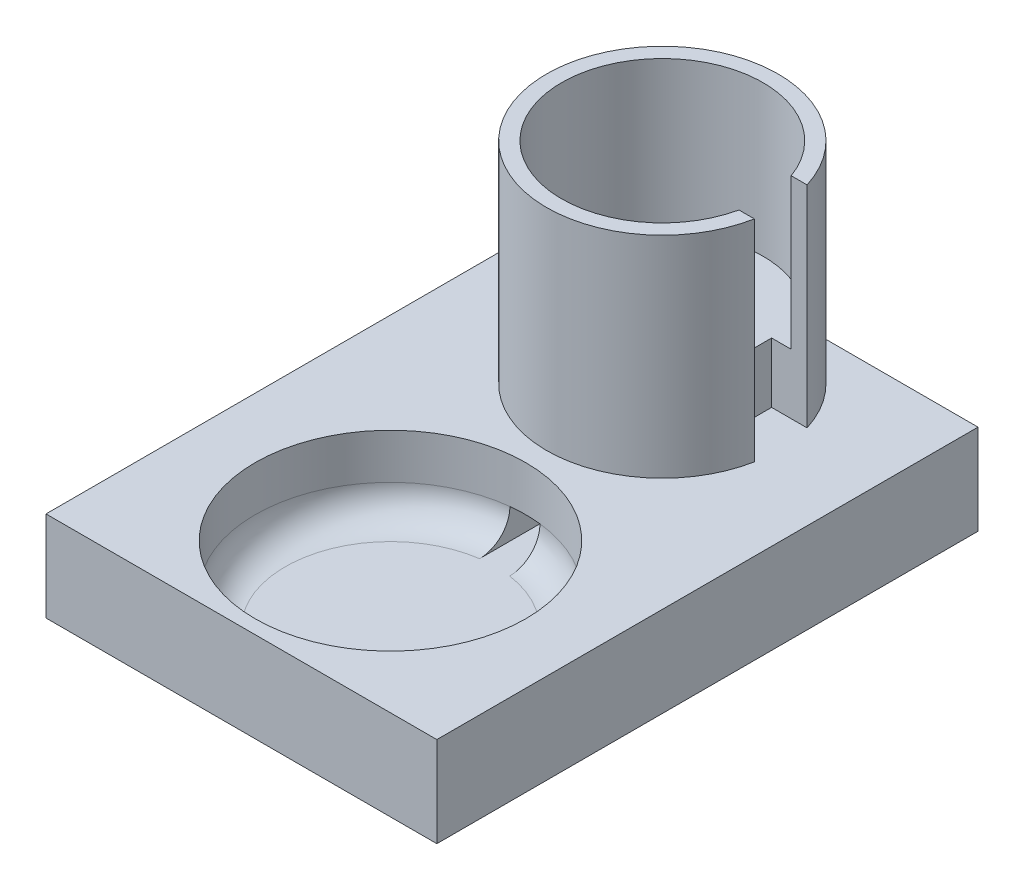
ISO-10303-21;
HEADER;
FILE_DESCRIPTION(('STEP AP214'),'2;1');
FILE_NAME('part.step','',(''),(''),'','','');
FILE_SCHEMA(('AUTOMOTIVE_DESIGN { 1 0 10303 214 1 1 1 1 }'));
ENDSEC;
DATA;
#1=APPLICATION_CONTEXT('core data for automotive mechanical design processes');
#2=APPLICATION_PROTOCOL_DEFINITION('international standard','automotive_design',2000,#1);
#3=PRODUCT_CONTEXT('',#1,'mechanical');
#4=PRODUCT('Part','Part','',(#3));
#5=PRODUCT_RELATED_PRODUCT_CATEGORY('part','',(#4));
#6=PRODUCT_DEFINITION_FORMATION('','',#4);
#7=PRODUCT_DEFINITION_CONTEXT('part definition',#1,'design');
#8=PRODUCT_DEFINITION('design','',#6,#7);
#9=PRODUCT_DEFINITION_SHAPE('','',#8);
#10=(LENGTH_UNIT() NAMED_UNIT(*) SI_UNIT(.MILLI.,.METRE.));
#11=(NAMED_UNIT(*) PLANE_ANGLE_UNIT() SI_UNIT($,.RADIAN.));
#12=(NAMED_UNIT(*) SI_UNIT($,.STERADIAN.) SOLID_ANGLE_UNIT());
#13=UNCERTAINTY_MEASURE_WITH_UNIT(LENGTH_MEASURE(1.E-05),#10,'distance_accuracy_value','');
#14=(GEOMETRIC_REPRESENTATION_CONTEXT(3) GLOBAL_UNCERTAINTY_ASSIGNED_CONTEXT((#13)) GLOBAL_UNIT_ASSIGNED_CONTEXT((#10,
#11,#12)) REPRESENTATION_CONTEXT('',''));
#15=CARTESIAN_POINT('',(0.,0.,0.));
#16=DIRECTION('',(0.,0.,1.));
#17=DIRECTION('',(1.,0.,0.));
#18=AXIS2_PLACEMENT_3D('',#15,#16,#17);
#19=CARTESIAN_POINT('',(-65.,30.,-180.));
#20=DIRECTION('',(-1.,0.,0.));
#21=DIRECTION('',(0.,0.,1.));
#22=AXIS2_PLACEMENT_3D('',#19,#20,#21);
#23=PLANE('',#22);
#24=DIRECTION('',(0.,-1.,0.));
#25=VECTOR('',#24,1.);
#26=CARTESIAN_POINT('',(-65.,30.,0.));
#27=LINE('',#26,#25);
#28=CARTESIAN_POINT('',(-65.,30.,0.));
#29=VERTEX_POINT('',#28);
#30=CARTESIAN_POINT('',(-65.,0.,0.));
#31=VERTEX_POINT('',#30);
#32=EDGE_CURVE('E271',#29,#31,#27,.T.);
#33=ORIENTED_EDGE('',*,*,#32,.F.);
#34=DIRECTION('',(0.,0.,1.));
#35=VECTOR('',#34,1.);
#36=CARTESIAN_POINT('',(-65.,30.,-180.));
#37=LINE('',#36,#35);
#38=CARTESIAN_POINT('',(-65.,30.,-180.));
#39=VERTEX_POINT('',#38);
#40=EDGE_CURVE('E306',#39,#29,#37,.T.);
#41=ORIENTED_EDGE('',*,*,#40,.F.);
#42=DIRECTION('',(0.,-1.,0.));
#43=VECTOR('',#42,1.);
#44=CARTESIAN_POINT('',(-65.,30.,-180.));
#45=LINE('',#44,#43);
#46=CARTESIAN_POINT('',(-65.,0.,-180.));
#47=VERTEX_POINT('',#46);
#48=EDGE_CURVE('E274',#39,#47,#45,.T.);
#49=ORIENTED_EDGE('',*,*,#48,.T.);
#50=DIRECTION('',(0.,0.,1.));
#51=VECTOR('',#50,1.);
#52=CARTESIAN_POINT('',(-65.,0.,-180.));
#53=LINE('',#52,#51);
#54=EDGE_CURVE('E291',#47,#31,#53,.T.);
#55=ORIENTED_EDGE('',*,*,#54,.T.);
#56=EDGE_LOOP('',(#33,#41,#49,#55));
#57=FACE_BOUND('',#56,.T.);
#58=ADVANCED_FACE('F44',(#57),#23,.T.);
#59=CARTESIAN_POINT('',(-65.,30.,-180.));
#60=DIRECTION('',(0.,1.,0.));
#61=DIRECTION('',(0.,0.,1.));
#62=AXIS2_PLACEMENT_3D('',#59,#60,#61);
#63=PLANE('',#62);
#64=DIRECTION('',(-1.,0.,0.));
#65=VECTOR('',#64,1.);
#66=CARTESIAN_POINT('',(-65.,30.,0.));
#67=LINE('',#66,#65);
#68=CARTESIAN_POINT('',(65.,30.,0.));
#69=VERTEX_POINT('',#68);
#70=EDGE_CURVE('E279',#69,#29,#67,.T.);
#71=ORIENTED_EDGE('',*,*,#70,.F.);
#72=DIRECTION('',(0.,0.,1.));
#73=VECTOR('',#72,1.);
#74=CARTESIAN_POINT('',(65.,30.,-180.));
#75=LINE('',#74,#73);
#76=CARTESIAN_POINT('',(65.,30.,-180.));
#77=VERTEX_POINT('',#76);
#78=EDGE_CURVE('E310',#77,#69,#75,.T.);
#79=ORIENTED_EDGE('',*,*,#78,.F.);
#80=DIRECTION('',(-1.,0.,0.));
#81=VECTOR('',#80,1.);
#82=CARTESIAN_POINT('',(-65.,30.,-180.));
#83=LINE('',#82,#81);
#84=EDGE_CURVE('E287',#77,#39,#83,.T.);
#85=ORIENTED_EDGE('',*,*,#84,.T.);
#86=ORIENTED_EDGE('',*,*,#40,.T.);
#87=EDGE_LOOP('',(#71,#79,#85,#86));
#88=FACE_BOUND('',#87,.T.);
#89=DIRECTION('',(1.,0.,0.));
#90=VECTOR('',#89,1.);
#91=CARTESIAN_POINT('',(25.,30.,-132.792943960581));
#92=LINE('',#91,#90);
#93=CARTESIAN_POINT('',(25.,30.,-132.792943960581));
#94=VERTEX_POINT('',#93);
#95=CARTESIAN_POINT('',(37.8194175423773,30.,-132.792943960581));
#96=VERTEX_POINT('',#95);
#97=EDGE_CURVE('E177',#94,#96,#92,.T.);
#98=ORIENTED_EDGE('',*,*,#97,.T.);
#99=CARTESIAN_POINT('',(0.,30.,-140.));
#100=DIRECTION('',(0.,1.,0.));
#101=DIRECTION('',(1.,0.,0.));
#102=AXIS2_PLACEMENT_3D('',#99,#100,#101);
#103=CIRCLE('',#102,38.5);
#104=CARTESIAN_POINT('',(36.7883595661956,30.,-151.351942583906));
#105=VERTEX_POINT('',#104);
#106=EDGE_CURVE('E266',#105,#96,#103,.T.);
#107=ORIENTED_EDGE('',*,*,#106,.F.);
#108=DIRECTION('',(1.,0.,0.));
#109=VECTOR('',#108,1.);
#110=CARTESIAN_POINT('',(25.,30.,-151.351942583906));
#111=LINE('',#110,#109);
#112=CARTESIAN_POINT('',(25.,30.,-151.351942583906));
#113=VERTEX_POINT('',#112);
#114=EDGE_CURVE('E185',#113,#105,#111,.T.);
#115=ORIENTED_EDGE('',*,*,#114,.F.);
#116=DIRECTION('',(0.,0.,-1.));
#117=VECTOR('',#116,1.);
#118=CARTESIAN_POINT('',(25.,30.,-132.792943960581));
#119=LINE('',#118,#117);
#120=EDGE_CURVE('E169',#94,#113,#119,.T.);
#121=ORIENTED_EDGE('',*,*,#120,.F.);
#122=EDGE_LOOP('',(#98,#107,#115,#121));
#123=FACE_BOUND('',#122,.T.);
#124=CARTESIAN_POINT('',(0.,30.,-49.5717696754532));
#125=DIRECTION('',(0.,1.,0.));
#126=DIRECTION('',(0.,0.,1.));
#127=AXIS2_PLACEMENT_3D('',#124,#125,#126);
#128=CIRCLE('',#127,45.);
#129=CARTESIAN_POINT('',(0.,30.,-4.57176967545322));
#130=VERTEX_POINT('',#129);
#131=EDGE_CURVE('E255',#130,#130,#128,.T.);
#132=ORIENTED_EDGE('',*,*,#131,.F.);
#133=EDGE_LOOP('',(#132));
#134=FACE_BOUND('',#133,.T.);
#135=ADVANCED_FACE('F188',(#88,#123,#134),#63,.T.);
#136=CARTESIAN_POINT('',(65.,30.,-180.));
#137=DIRECTION('',(1.,0.,0.));
#138=DIRECTION('',(0.,0.,-1.));
#139=AXIS2_PLACEMENT_3D('',#136,#137,#138);
#140=PLANE('',#139);
#141=DIRECTION('',(0.,1.,0.));
#142=VECTOR('',#141,1.);
#143=CARTESIAN_POINT('',(65.,30.,0.));
#144=LINE('',#143,#142);
#145=CARTESIAN_POINT('',(65.,0.,0.));
#146=VERTEX_POINT('',#145);
#147=EDGE_CURVE('E299',#146,#69,#144,.T.);
#148=ORIENTED_EDGE('',*,*,#147,.F.);
#149=DIRECTION('',(0.,0.,1.));
#150=VECTOR('',#149,1.);
#151=CARTESIAN_POINT('',(65.,0.,-180.));
#152=LINE('',#151,#150);
#153=CARTESIAN_POINT('',(65.,0.,-180.));
#154=VERTEX_POINT('',#153);
#155=EDGE_CURVE('E313',#154,#146,#152,.T.);
#156=ORIENTED_EDGE('',*,*,#155,.F.);
#157=DIRECTION('',(0.,1.,0.));
#158=VECTOR('',#157,1.);
#159=CARTESIAN_POINT('',(65.,30.,-180.));
#160=LINE('',#159,#158);
#161=EDGE_CURVE('E283',#154,#77,#160,.T.);
#162=ORIENTED_EDGE('',*,*,#161,.T.);
#163=ORIENTED_EDGE('',*,*,#78,.T.);
#164=EDGE_LOOP('',(#148,#156,#162,#163));
#165=FACE_BOUND('',#164,.T.);
#166=ADVANCED_FACE('F410',(#165),#140,.T.);
#167=CARTESIAN_POINT('',(-65.,0.,-180.));
#168=DIRECTION('',(0.,-1.,0.));
#169=DIRECTION('',(0.,0.,-1.));
#170=AXIS2_PLACEMENT_3D('',#167,#168,#169);
#171=PLANE('',#170);
#172=DIRECTION('',(1.,0.,0.));
#173=VECTOR('',#172,1.);
#174=CARTESIAN_POINT('',(-65.,0.,0.));
#175=LINE('',#174,#173);
#176=EDGE_CURVE('E295',#31,#146,#175,.T.);
#177=ORIENTED_EDGE('',*,*,#176,.F.);
#178=ORIENTED_EDGE('',*,*,#54,.F.);
#179=DIRECTION('',(1.,0.,0.));
#180=VECTOR('',#179,1.);
#181=CARTESIAN_POINT('',(-65.,0.,-180.));
#182=LINE('',#181,#180);
#183=EDGE_CURVE('E278',#47,#154,#182,.T.);
#184=ORIENTED_EDGE('',*,*,#183,.T.);
#185=ORIENTED_EDGE('',*,*,#155,.T.);
#186=EDGE_LOOP('',(#177,#178,#184,#185));
#187=FACE_BOUND('',#186,.T.);
#188=ADVANCED_FACE('F403',(#187),#171,.T.);
#189=CARTESIAN_POINT('',(0.,0.,-180.));
#190=DIRECTION('',(0.,0.,1.));
#191=DIRECTION('',(1.,0.,0.));
#192=AXIS2_PLACEMENT_3D('',#189,#190,#191);
#193=PLANE('',#192);
#194=ORIENTED_EDGE('',*,*,#48,.F.);
#195=ORIENTED_EDGE('',*,*,#84,.F.);
#196=ORIENTED_EDGE('',*,*,#161,.F.);
#197=ORIENTED_EDGE('',*,*,#183,.F.);
#198=EDGE_LOOP('',(#194,#195,#196,#197));
#199=FACE_BOUND('',#198,.T.);
#200=ADVANCED_FACE('F400',(#199),#193,.F.);
#201=CARTESIAN_POINT('',(0.,0.,0.));
#202=DIRECTION('',(0.,0.,1.));
#203=DIRECTION('',(1.,0.,0.));
#204=AXIS2_PLACEMENT_3D('',#201,#202,#203);
#205=PLANE('',#204);
#206=ORIENTED_EDGE('',*,*,#32,.T.);
#207=ORIENTED_EDGE('',*,*,#176,.T.);
#208=ORIENTED_EDGE('',*,*,#147,.T.);
#209=ORIENTED_EDGE('',*,*,#70,.T.);
#210=EDGE_LOOP('',(#206,#207,#208,#209));
#211=FACE_BOUND('',#210,.T.);
#212=ADVANCED_FACE('F395',(#211),#205,.T.);
#213=CARTESIAN_POINT('',(0.,100.,-140.));
#214=DIRECTION('',(0.,1.,0.));
#215=DIRECTION('',(0.,0.,1.));
#216=AXIS2_PLACEMENT_3D('',#213,#214,#215);
#217=PLANE('',#216);
#218=DIRECTION('',(1.,0.,0.));
#219=VECTOR('',#218,1.);
#220=CARTESIAN_POINT('',(0.,100.,-132.792943960581));
#221=LINE('',#220,#219);
#222=CARTESIAN_POINT('',(32.7155672921115,100.,-132.792943960581));
#223=VERTEX_POINT('',#222);
#224=CARTESIAN_POINT('',(37.8194175423773,100.,-132.792943960581));
#225=VERTEX_POINT('',#224);
#226=EDGE_CURVE('E211',#223,#225,#221,.T.);
#227=ORIENTED_EDGE('',*,*,#226,.F.);
#228=CARTESIAN_POINT('',(0.,100.,-140.));
#229=DIRECTION('',(0.,1.,0.));
#230=DIRECTION('',(0.,0.,1.));
#231=AXIS2_PLACEMENT_3D('',#228,#229,#230);
#232=CIRCLE('',#231,33.5);
#233=CARTESIAN_POINT('',(31.5179853349115,100.,-151.351942583906));
#234=VERTEX_POINT('',#233);
#235=EDGE_CURVE('E262',#234,#223,#232,.T.);
#236=ORIENTED_EDGE('',*,*,#235,.F.);
#237=DIRECTION('',(-1.,0.,0.));
#238=VECTOR('',#237,1.);
#239=CARTESIAN_POINT('',(0.,100.,-151.351942583906));
#240=LINE('',#239,#238);
#241=CARTESIAN_POINT('',(36.7883595661956,100.,-151.351942583906));
#242=VERTEX_POINT('',#241);
#243=EDGE_CURVE('E201',#242,#234,#240,.T.);
#244=ORIENTED_EDGE('',*,*,#243,.F.);
#245=CARTESIAN_POINT('',(0.,100.,-140.));
#246=DIRECTION('',(0.,1.,0.));
#247=DIRECTION('',(1.,0.,0.));
#248=AXIS2_PLACEMENT_3D('',#245,#246,#247);
#249=CIRCLE('',#248,38.5);
#250=EDGE_CURVE('E267',#242,#225,#249,.T.);
#251=ORIENTED_EDGE('',*,*,#250,.T.);
#252=EDGE_LOOP('',(#227,#236,#244,#251));
#253=FACE_BOUND('',#252,.T.);
#254=ADVANCED_FACE('F392',(#253),#217,.T.);
#255=CARTESIAN_POINT('',(0.,100.,-140.));
#256=DIRECTION('',(0.,-1.,0.));
#257=DIRECTION('',(0.,0.,-1.));
#258=AXIS2_PLACEMENT_3D('',#255,#256,#257);
#259=CYLINDRICAL_SURFACE('',#258,38.5);
#260=ORIENTED_EDGE('',*,*,#106,.T.);
#261=DIRECTION('',(0.,-1.,0.));
#262=VECTOR('',#261,1.);
#263=CARTESIAN_POINT('',(37.8194175423773,100.,-132.792943960581));
#264=LINE('',#263,#262);
#265=EDGE_CURVE('E180',#96,#225,#264,.F.);
#266=ORIENTED_EDGE('',*,*,#265,.T.);
#267=ORIENTED_EDGE('',*,*,#250,.F.);
#268=DIRECTION('',(0.,-1.,0.));
#269=VECTOR('',#268,1.);
#270=CARTESIAN_POINT('',(36.7883595661956,100.,-151.351942583906));
#271=LINE('',#270,#269);
#272=EDGE_CURVE('E204',#242,#105,#271,.T.);
#273=ORIENTED_EDGE('',*,*,#272,.T.);
#274=EDGE_LOOP('',(#260,#266,#267,#273));
#275=FACE_BOUND('',#274,.T.);
#276=ADVANCED_FACE('F390',(#275),#259,.T.);
#277=CARTESIAN_POINT('',(0.,100.,-140.));
#278=DIRECTION('',(0.,-1.,0.));
#279=DIRECTION('',(0.,0.,-1.));
#280=AXIS2_PLACEMENT_3D('',#277,#278,#279);
#281=CYLINDRICAL_SURFACE('',#280,33.5);
#282=DIRECTION('',(0.,-1.,0.));
#283=VECTOR('',#282,1.);
#284=CARTESIAN_POINT('',(32.7155672921115,100.,-132.792943960581));
#285=LINE('',#284,#283);
#286=CARTESIAN_POINT('',(32.7155672921115,50.,-132.792943960581));
#287=VERTEX_POINT('',#286);
#288=EDGE_CURVE('E208',#287,#223,#285,.F.);
#289=ORIENTED_EDGE('',*,*,#288,.F.);
#290=CARTESIAN_POINT('',(0.,50.,-140.));
#291=DIRECTION('',(0.,1.,0.));
#292=DIRECTION('',(0.,0.,1.));
#293=AXIS2_PLACEMENT_3D('',#290,#291,#292);
#294=CIRCLE('',#293,33.5);
#295=CARTESIAN_POINT('',(31.5179853349115,50.,-151.351942583906));
#296=VERTEX_POINT('',#295);
#297=EDGE_CURVE('E309',#296,#287,#294,.T.);
#298=ORIENTED_EDGE('',*,*,#297,.F.);
#299=DIRECTION('',(0.,-1.,0.));
#300=VECTOR('',#299,1.);
#301=CARTESIAN_POINT('',(31.5179853349115,100.,-151.351942583906));
#302=LINE('',#301,#300);
#303=EDGE_CURVE('E197',#234,#296,#302,.T.);
#304=ORIENTED_EDGE('',*,*,#303,.F.);
#305=ORIENTED_EDGE('',*,*,#235,.T.);
#306=EDGE_LOOP('',(#289,#298,#304,#305));
#307=FACE_BOUND('',#306,.T.);
#308=ADVANCED_FACE('F386',(#307),#281,.F.);
#309=CARTESIAN_POINT('',(0.,5.,-49.5717696754532));
#310=DIRECTION('',(0.,1.,0.));
#311=DIRECTION('',(0.,0.,1.));
#312=AXIS2_PLACEMENT_3D('',#309,#310,#311);
#313=CYLINDRICAL_SURFACE('',#312,45.);
#314=CARTESIAN_POINT('',(0.,15.,-49.5717696754532));
#315=DIRECTION('',(0.,1.,0.));
#316=DIRECTION('',(0.,0.,1.));
#317=AXIS2_PLACEMENT_3D('',#314,#315,#316);
#318=CIRCLE('',#317,45.);
#319=CARTESIAN_POINT('',(-5.,15.,-94.293129225449));
#320=VERTEX_POINT('',#319);
#321=CARTESIAN_POINT('',(5.,15.,-94.293129225449));
#322=VERTEX_POINT('',#321);
#323=EDGE_CURVE('E246',#320,#322,#318,.F.);
#324=ORIENTED_EDGE('',*,*,#323,.T.);
#325=CARTESIAN_POINT('',(0.,15.,-49.5717696754532));
#326=DIRECTION('',(0.,1.,0.));
#327=DIRECTION('',(0.,0.,1.));
#328=AXIS2_PLACEMENT_3D('',#325,#326,#327);
#329=CIRCLE('',#328,45.);
#330=EDGE_CURVE('E348',#322,#320,#329,.F.);
#331=ORIENTED_EDGE('',*,*,#330,.T.);
#332=EDGE_LOOP('',(#324,#331));
#333=FACE_BOUND('',#332,.T.);
#334=ORIENTED_EDGE('',*,*,#131,.T.);
#335=EDGE_LOOP('',(#334));
#336=FACE_BOUND('',#335,.T.);
#337=ADVANCED_FACE('F383',(#333,#336),#313,.F.);
#338=CARTESIAN_POINT('',(0.,5.,-49.5717696754532));
#339=DIRECTION('',(0.,1.,0.));
#340=DIRECTION('',(0.,0.,1.));
#341=AXIS2_PLACEMENT_3D('',#338,#339,#340);
#342=PLANE('',#341);
#343=CARTESIAN_POINT('',(0.,5.,-49.5717696754532));
#344=DIRECTION('',(0.,1.,0.));
#345=DIRECTION('',(0.,0.,1.));
#346=AXIS2_PLACEMENT_3D('',#343,#344,#345);
#347=CIRCLE('',#346,35.);
#348=CARTESIAN_POINT('',(-5.,5.,-84.2127858268308));
#349=VERTEX_POINT('',#348);
#350=CARTESIAN_POINT('',(5.,5.,-84.2127858268308));
#351=VERTEX_POINT('',#350);
#352=EDGE_CURVE('E345',#349,#351,#347,.T.);
#353=ORIENTED_EDGE('',*,*,#352,.T.);
#354=DIRECTION('',(0.,0.,1.));
#355=VECTOR('',#354,1.);
#356=CARTESIAN_POINT('',(5.,5.,-150.));
#357=LINE('',#356,#355);
#358=CARTESIAN_POINT('',(5.,5.,-150.));
#359=VERTEX_POINT('',#358);
#360=EDGE_CURVE('E66',#359,#351,#357,.T.);
#361=ORIENTED_EDGE('',*,*,#360,.F.);
#362=DIRECTION('',(1.,0.,0.));
#363=VECTOR('',#362,1.);
#364=CARTESIAN_POINT('',(-5.,5.,-150.));
#365=LINE('',#364,#363);
#366=CARTESIAN_POINT('',(-5.,5.,-150.));
#367=VERTEX_POINT('',#366);
#368=EDGE_CURVE('E219',#367,#359,#365,.T.);
#369=ORIENTED_EDGE('',*,*,#368,.F.);
#370=DIRECTION('',(0.,0.,1.));
#371=VECTOR('',#370,1.);
#372=CARTESIAN_POINT('',(-5.,5.,-150.));
#373=LINE('',#372,#371);
#374=EDGE_CURVE('E74',#367,#349,#373,.T.);
#375=ORIENTED_EDGE('',*,*,#374,.T.);
#376=EDGE_LOOP('',(#353,#361,#369,#375));
#377=FACE_BOUND('',#376,.T.);
#378=ADVANCED_FACE('F379',(#377),#342,.T.);
#379=CARTESIAN_POINT('',(0.,50.,-140.));
#380=DIRECTION('',(0.,1.,0.));
#381=DIRECTION('',(0.,0.,1.));
#382=AXIS2_PLACEMENT_3D('',#379,#380,#381);
#383=PLANE('',#382);
#384=DIRECTION('',(1.,0.,0.));
#385=VECTOR('',#384,1.);
#386=CARTESIAN_POINT('',(0.,50.,-132.792943960581));
#387=LINE('',#386,#385);
#388=CARTESIAN_POINT('',(25.,50.,-132.792943960581));
#389=VERTEX_POINT('',#388);
#390=EDGE_CURVE('E342',#389,#287,#387,.T.);
#391=ORIENTED_EDGE('',*,*,#390,.F.);
#392=DIRECTION('',(0.,0.,-1.));
#393=VECTOR('',#392,1.);
#394=CARTESIAN_POINT('',(25.,50.,-140.));
#395=LINE('',#394,#393);
#396=CARTESIAN_POINT('',(25.,50.,-151.351942583906));
#397=VERTEX_POINT('',#396);
#398=EDGE_CURVE('E171',#389,#397,#395,.T.);
#399=ORIENTED_EDGE('',*,*,#398,.T.);
#400=DIRECTION('',(-1.,0.,0.));
#401=VECTOR('',#400,1.);
#402=CARTESIAN_POINT('',(0.,50.,-151.351942583906));
#403=LINE('',#402,#401);
#404=EDGE_CURVE('E338',#296,#397,#403,.T.);
#405=ORIENTED_EDGE('',*,*,#404,.F.);
#406=ORIENTED_EDGE('',*,*,#297,.T.);
#407=EDGE_LOOP('',(#391,#399,#405,#406));
#408=FACE_BOUND('',#407,.T.);
#409=CARTESIAN_POINT('',(0.,50.,-140.));
#410=DIRECTION('',(0.,1.,0.));
#411=DIRECTION('',(0.,0.,1.));
#412=AXIS2_PLACEMENT_3D('',#409,#410,#411);
#413=CIRCLE('',#412,20.);
#414=CARTESIAN_POINT('',(0.,50.,-120.));
#415=VERTEX_POINT('',#414);
#416=EDGE_CURVE('E250',#415,#415,#413,.T.);
#417=ORIENTED_EDGE('',*,*,#416,.F.);
#418=EDGE_LOOP('',(#417));
#419=FACE_BOUND('',#418,.T.);
#420=ADVANCED_FACE('F375',(#408,#419),#383,.T.);
#421=CARTESIAN_POINT('',(0.,10.,-140.));
#422=DIRECTION('',(0.,1.,0.));
#423=DIRECTION('',(0.,0.,1.));
#424=AXIS2_PLACEMENT_3D('',#421,#422,#423);
#425=CYLINDRICAL_SURFACE('',#424,20.);
#426=CARTESIAN_POINT('',(0.,15.,-140.));
#427=DIRECTION('',(0.,1.,0.));
#428=DIRECTION('',(0.,0.,1.));
#429=AXIS2_PLACEMENT_3D('',#426,#427,#428);
#430=CIRCLE('',#429,20.);
#431=CARTESIAN_POINT('',(5.,15.,-120.635083268963));
#432=VERTEX_POINT('',#431);
#433=CARTESIAN_POINT('',(-5.,15.,-120.635083268963));
#434=VERTEX_POINT('',#433);
#435=EDGE_CURVE('E332',#432,#434,#430,.F.);
#436=ORIENTED_EDGE('',*,*,#435,.T.);
#437=DIRECTION('',(0.,1.,0.));
#438=VECTOR('',#437,1.);
#439=CARTESIAN_POINT('',(-5.,10.,-120.635083268963));
#440=LINE('',#439,#438);
#441=CARTESIAN_POINT('',(-5.,10.,-120.635083268963));
#442=VERTEX_POINT('',#441);
#443=EDGE_CURVE('E242',#434,#442,#440,.F.);
#444=ORIENTED_EDGE('',*,*,#443,.T.);
#445=CARTESIAN_POINT('',(0.,10.,-140.));
#446=DIRECTION('',(0.,1.,0.));
#447=DIRECTION('',(0.,0.,1.));
#448=AXIS2_PLACEMENT_3D('',#445,#446,#447);
#449=CIRCLE('',#448,20.);
#450=CARTESIAN_POINT('',(5.,10.,-120.635083268963));
#451=VERTEX_POINT('',#450);
#452=EDGE_CURVE('E251',#451,#442,#449,.T.);
#453=ORIENTED_EDGE('',*,*,#452,.F.);
#454=DIRECTION('',(0.,1.,0.));
#455=VECTOR('',#454,1.);
#456=CARTESIAN_POINT('',(5.,10.,-120.635083268963));
#457=LINE('',#456,#455);
#458=EDGE_CURVE('E230',#451,#432,#457,.T.);
#459=ORIENTED_EDGE('',*,*,#458,.T.);
#460=EDGE_LOOP('',(#436,#444,#453,#459));
#461=FACE_BOUND('',#460,.T.);
#462=ORIENTED_EDGE('',*,*,#416,.T.);
#463=EDGE_LOOP('',(#462));
#464=FACE_BOUND('',#463,.T.);
#465=ADVANCED_FACE('F371',(#461,#464),#425,.F.);
#466=CARTESIAN_POINT('',(0.,10.,-140.));
#467=DIRECTION('',(0.,1.,0.));
#468=DIRECTION('',(0.,0.,1.));
#469=AXIS2_PLACEMENT_3D('',#466,#467,#468);
#470=PLANE('',#469);
#471=DIRECTION('',(0.,0.,1.));
#472=VECTOR('',#471,1.);
#473=CARTESIAN_POINT('',(-5.,10.,-140.));
#474=LINE('',#473,#472);
#475=CARTESIAN_POINT('',(-5.,10.,-150.));
#476=VERTEX_POINT('',#475);
#477=EDGE_CURVE('E329',#476,#442,#474,.T.);
#478=ORIENTED_EDGE('',*,*,#477,.F.);
#479=DIRECTION('',(1.,0.,0.));
#480=VECTOR('',#479,1.);
#481=CARTESIAN_POINT('',(0.,10.,-150.));
#482=LINE('',#481,#480);
#483=CARTESIAN_POINT('',(5.,10.,-150.));
#484=VERTEX_POINT('',#483);
#485=EDGE_CURVE('E321',#476,#484,#482,.T.);
#486=ORIENTED_EDGE('',*,*,#485,.T.);
#487=DIRECTION('',(0.,0.,-1.));
#488=VECTOR('',#487,1.);
#489=CARTESIAN_POINT('',(5.,10.,-140.));
#490=LINE('',#489,#488);
#491=EDGE_CURVE('E325',#451,#484,#490,.T.);
#492=ORIENTED_EDGE('',*,*,#491,.F.);
#493=ORIENTED_EDGE('',*,*,#452,.T.);
#494=EDGE_LOOP('',(#478,#486,#492,#493));
#495=FACE_BOUND('',#494,.T.);
#496=ADVANCED_FACE('F368',(#495),#470,.T.);
#497=CARTESIAN_POINT('',(-5.,15.,-150.));
#498=DIRECTION('',(0.,1.,0.));
#499=DIRECTION('',(0.,0.,1.));
#500=AXIS2_PLACEMENT_3D('',#497,#498,#499);
#501=PLANE('',#500);
#502=DIRECTION('',(0.,0.,1.));
#503=VECTOR('',#502,1.);
#504=CARTESIAN_POINT('',(-5.,15.,-150.));
#505=LINE('',#504,#503);
#506=EDGE_CURVE('E226',#434,#320,#505,.T.);
#507=ORIENTED_EDGE('',*,*,#506,.F.);
#508=ORIENTED_EDGE('',*,*,#435,.F.);
#509=DIRECTION('',(0.,0.,1.));
#510=VECTOR('',#509,1.);
#511=CARTESIAN_POINT('',(5.,15.,-150.));
#512=LINE('',#511,#510);
#513=EDGE_CURVE('E231',#432,#322,#512,.T.);
#514=ORIENTED_EDGE('',*,*,#513,.T.);
#515=ORIENTED_EDGE('',*,*,#323,.F.);
#516=EDGE_LOOP('',(#507,#508,#514,#515));
#517=FACE_BOUND('',#516,.T.);
#518=ADVANCED_FACE('F362',(#517),#501,.F.);
#519=CARTESIAN_POINT('',(-5.,15.,-150.));
#520=DIRECTION('',(-1.,0.,0.));
#521=DIRECTION('',(0.,0.,1.));
#522=AXIS2_PLACEMENT_3D('',#519,#520,#521);
#523=PLANE('',#522);
#524=ORIENTED_EDGE('',*,*,#374,.F.);
#525=DIRECTION('',(0.,-1.,0.));
#526=VECTOR('',#525,1.);
#527=CARTESIAN_POINT('',(-5.,15.,-150.));
#528=LINE('',#527,#526);
#529=EDGE_CURVE('E216',#476,#367,#528,.T.);
#530=ORIENTED_EDGE('',*,*,#529,.F.);
#531=ORIENTED_EDGE('',*,*,#477,.T.);
#532=ORIENTED_EDGE('',*,*,#443,.F.);
#533=ORIENTED_EDGE('',*,*,#506,.T.);
#534=CARTESIAN_POINT('',(-5.,15.,-94.293129225449));
#535=CARTESIAN_POINT('',(-5.,14.7200923125387,-94.2931602937347));
#536=CARTESIAN_POINT('',(-5.,14.4401894624792,-94.2813050702527));
#537=CARTESIAN_POINT('',(-5.,13.8823942969534,-94.2340467092046));
#538=CARTESIAN_POINT('',(-5.,13.6045018661874,-94.1986449330548));
#539=CARTESIAN_POINT('',(-5.,13.0529453716614,-94.1045606981119));
#540=CARTESIAN_POINT('',(-5.,12.7792777074278,-94.0458993461193));
#541=CARTESIAN_POINT('',(-5.,12.2378593605255,-93.9057351049252));
#542=CARTESIAN_POINT('',(-5.,11.970108616378,-93.8242324531728));
#543=CARTESIAN_POINT('',(-5.,11.4423069121622,-93.6389385544321));
#544=CARTESIAN_POINT('',(-5.,11.1822592564816,-93.535137895435));
#545=CARTESIAN_POINT('',(-5.,10.6718138451402,-93.3060230542473));
#546=CARTESIAN_POINT('',(-5.,10.4214163195903,-93.1807083594345));
#547=CARTESIAN_POINT('',(-5.,9.93207657148305,-92.9094981391638));
#548=CARTESIAN_POINT('',(-5.,9.69313264354701,-92.7636056904553));
#549=CARTESIAN_POINT('',(-5.,9.22833353417702,-92.4522830850178));
#550=CARTESIAN_POINT('',(-5.,9.00247831042227,-92.2868529914667));
#551=CARTESIAN_POINT('',(-5.,8.56492078156046,-91.9372433185785));
#552=CARTESIAN_POINT('',(-5.,8.35325243206286,-91.7530212430116));
#553=CARTESIAN_POINT('',(-5.,7.9461105427096,-91.3674749165842));
#554=CARTESIAN_POINT('',(-5.,7.7506370905322,-91.1661505731448));
#555=CARTESIAN_POINT('',(-5.,7.37719634331322,-90.7478061563837));
#556=CARTESIAN_POINT('',(-5.,7.19923230988858,-90.5307831717683));
#557=CARTESIAN_POINT('',(-5.,6.86206699245111,-90.0826271758148));
#558=CARTESIAN_POINT('',(-5.,6.70286552198422,-89.8514943047291));
#559=CARTESIAN_POINT('',(-5.,6.40337998252815,-89.3752983471017));
#560=CARTESIAN_POINT('',(-5.,6.26321791386351,-89.1301585246962));
#561=CARTESIAN_POINT('',(-5.,6.00391699392986,-88.629007818842));
#562=CARTESIAN_POINT('',(-5.,5.8847780611216,-88.3729969775619));
#563=CARTESIAN_POINT('',(-5.,5.66834709996099,-87.8519908283245));
#564=CARTESIAN_POINT('',(-5.,5.57104781939373,-87.5869985365489));
#565=CARTESIAN_POINT('',(-5.,5.39890106594442,-87.0499279837191));
#566=CARTESIAN_POINT('',(-5.,5.32404872821687,-86.7778512719583));
#567=CARTESIAN_POINT('',(-5.,5.17401136455507,-86.1276659028753));
#568=CARTESIAN_POINT('',(-5.,5.1087338810561,-85.7471999429121));
#569=CARTESIAN_POINT('',(-5.,5.04348937180929,-85.1733264507481));
#570=CARTESIAN_POINT('',(-5.,5.02718649114673,-84.9816196308832));
#571=CARTESIAN_POINT('',(-5.,5.00544197809891,-84.5975539265514));
#572=CARTESIAN_POINT('',(-5.,5.00000242813757,-84.4051949241435));
#573=CARTESIAN_POINT('',(-5.,5.,-84.2127858268308));
#574=B_SPLINE_CURVE_WITH_KNOTS('',3,(#534,#535,#536,#537,#538,#539,#540,#541,#542,#543,#544,
#545,#546,#547,#548,#549,#550,#551,#552,#553,#554,#555,#556,#557,#558,#559,#560,#561,#562,#563,
#564,#565,#566,#567,#568,#569,#570,#571,#572,#573),.UNSPECIFIED.,.F.,.F.,(4,2,2,2,2,2,2,2,2,2,2,
2,2,2,2,2,2,2,2,4),(0.,0.839465200109639,1.67888186817779,2.51753854818011,3.35618651017051,
4.19518916424538,5.03421181230016,5.87310914389694,6.71200376286544,7.55283938484432,
8.39367955876341,9.2346760672082,10.0756642174966,10.9218098155328,11.7679521316802,
12.6138130553346,13.4594905258748,14.614723008521,15.1916624697663,15.7687125156284),.UNSPECIFIED.);
#575=EDGE_CURVE('E12',#320,#349,#574,.T.);
#576=ORIENTED_EDGE('',*,*,#575,.T.);
#577=EDGE_LOOP('',(#524,#530,#531,#532,#533,#576));
#578=FACE_BOUND('',#577,.T.);
#579=ADVANCED_FACE('F361',(#578),#523,.F.);
#580=CARTESIAN_POINT('',(5.,15.,-150.));
#581=DIRECTION('',(1.,0.,0.));
#582=DIRECTION('',(0.,0.,-1.));
#583=AXIS2_PLACEMENT_3D('',#580,#581,#582);
#584=PLANE('',#583);
#585=ORIENTED_EDGE('',*,*,#513,.F.);
#586=ORIENTED_EDGE('',*,*,#458,.F.);
#587=ORIENTED_EDGE('',*,*,#491,.T.);
#588=DIRECTION('',(0.,1.,0.));
#589=VECTOR('',#588,1.);
#590=CARTESIAN_POINT('',(5.,15.,-150.));
#591=LINE('',#590,#589);
#592=EDGE_CURVE('E223',#359,#484,#591,.T.);
#593=ORIENTED_EDGE('',*,*,#592,.F.);
#594=ORIENTED_EDGE('',*,*,#360,.T.);
#595=CARTESIAN_POINT('',(5.,5.,-84.2127858268308));
#596=CARTESIAN_POINT('',(5.,4.99997051169307,-84.498201110577));
#597=CARTESIAN_POINT('',(5.,5.01196872575472,-84.7836159924303));
#598=CARTESIAN_POINT('',(5.,5.05984609444004,-85.3524334271672));
#599=CARTESIAN_POINT('',(5.,5.09572505389525,-85.6358359964776));
#600=CARTESIAN_POINT('',(5.,5.19116932738545,-86.1985033580227));
#601=CARTESIAN_POINT('',(5.,5.25072464732181,-86.4777698446259));
#602=CARTESIAN_POINT('',(5.,5.39313625692474,-87.0302914646222));
#603=CARTESIAN_POINT('',(5.,5.47599202743612,-87.3035467318045));
#604=CARTESIAN_POINT('',(5.,5.6645311438692,-87.8422773956816));
#605=CARTESIAN_POINT('',(5.,5.77023009876113,-88.1077473310127));
#606=CARTESIAN_POINT('',(5.,6.00371487143076,-88.6287962605465));
#607=CARTESIAN_POINT('',(5.,6.1315010239025,-88.8843751047947));
#608=CARTESIAN_POINT('',(5.,6.40824684501992,-89.3837052540761));
#609=CARTESIAN_POINT('',(5.,6.55720041188592,-89.6274599405079));
#610=CARTESIAN_POINT('',(5.,6.87527562473944,-90.1014332991469));
#611=CARTESIAN_POINT('',(5.,7.04439704456338,-90.3316521231029));
#612=CARTESIAN_POINT('',(5.,7.40054300432571,-90.7755145011154));
#613=CARTESIAN_POINT('',(5.,7.58745327158711,-90.9892497489275));
#614=CARTESIAN_POINT('',(5.,7.97871759773048,-91.4001077768524));
#615=CARTESIAN_POINT('',(5.,8.18307152633331,-91.5972306810136));
#616=CARTESIAN_POINT('',(5.,8.6078246148606,-91.9734539585079));
#617=CARTESIAN_POINT('',(5.,8.82822717696008,-92.1525504911195));
#618=CARTESIAN_POINT('',(5.,9.28346366602052,-92.4913444683462));
#619=CARTESIAN_POINT('',(5.,9.51829728480011,-92.6510423270116));
#620=CARTESIAN_POINT('',(5.,9.99893699113673,-92.9487548784041));
#621=CARTESIAN_POINT('',(5.,10.2446495542586,-93.0869205703868));
#622=CARTESIAN_POINT('',(5.,10.7468814560423,-93.3419533483181));
#623=CARTESIAN_POINT('',(5.,11.0034005395616,-93.4588209367694));
#624=CARTESIAN_POINT('',(5.,11.52528773112,-93.6703425525967));
#625=CARTESIAN_POINT('',(5.,11.7906509734731,-93.7650085712555));
#626=CARTESIAN_POINT('',(5.,12.3283415157273,-93.9314840595172));
#627=CARTESIAN_POINT('',(5.,12.6006669960827,-94.0032994363664));
#628=CARTESIAN_POINT('',(5.,13.2244239714492,-94.1397458540669));
#629=CARTESIAN_POINT('',(5.,13.5774531061034,-94.1972639139113));
#630=CARTESIAN_POINT('',(5.,14.1096659891039,-94.2547769367803));
#631=CARTESIAN_POINT('',(5.,14.2874202208518,-94.2691539198102));
#632=CARTESIAN_POINT('',(5.,14.6434360549419,-94.2883291443495));
#633=CARTESIAN_POINT('',(5.,14.8216976324305,-94.2931278472532));
#634=CARTESIAN_POINT('',(5.,15.,-94.293129225449));
#635=B_SPLINE_CURVE_WITH_KNOTS('',3,(#595,#596,#597,#598,#599,#600,#601,#602,#603,#604,#605,
#606,#607,#608,#609,#610,#611,#612,#613,#614,#615,#616,#617,#618,#619,#620,#621,#622,#623,#624,
#625,#626,#627,#628,#629,#630,#631,#632,#633,#634),.UNSPECIFIED.,.F.,.F.,(4,2,2,2,2,2,2,2,2,2,2,
2,2,2,2,2,2,2,2,4),(0.,0.855993506949227,1.71198001826668,2.56760558957684,3.42321209828298,
4.27940511026101,5.13561109753067,5.99157077118059,6.84752084694786,7.6983023570038,
8.54907751349843,9.40003355520764,10.2509714306985,11.0956436777231,11.9402959931602,
12.7844910476255,13.6284676868894,14.699174790842,15.2339617056417,15.7687228586614),.UNSPECIFIED.);
#636=EDGE_CURVE('E59',#351,#322,#635,.T.);
#637=ORIENTED_EDGE('',*,*,#636,.T.);
#638=EDGE_LOOP('',(#585,#586,#587,#593,#594,#637));
#639=FACE_BOUND('',#638,.T.);
#640=ADVANCED_FACE('F356',(#639),#584,.F.);
#641=CARTESIAN_POINT('',(0.,0.,-150.));
#642=DIRECTION('',(0.,0.,1.));
#643=DIRECTION('',(1.,0.,0.));
#644=AXIS2_PLACEMENT_3D('',#641,#642,#643);
#645=PLANE('',#644);
#646=ORIENTED_EDGE('',*,*,#529,.T.);
#647=ORIENTED_EDGE('',*,*,#368,.T.);
#648=ORIENTED_EDGE('',*,*,#592,.T.);
#649=ORIENTED_EDGE('',*,*,#485,.F.);
#650=EDGE_LOOP('',(#646,#647,#648,#649));
#651=FACE_BOUND('',#650,.T.);
#652=ADVANCED_FACE('F360',(#651),#645,.T.);
#653=CARTESIAN_POINT('',(25.,106.5552194832,-132.792943960581));
#654=DIRECTION('',(0.,0.,1.));
#655=DIRECTION('',(1.,0.,0.));
#656=AXIS2_PLACEMENT_3D('',#653,#654,#655);
#657=PLANE('',#656);
#658=ORIENTED_EDGE('',*,*,#97,.F.);
#659=DIRECTION('',(0.,-1.,0.));
#660=VECTOR('',#659,1.);
#661=CARTESIAN_POINT('',(25.,106.5552194832,-132.792943960581));
#662=LINE('',#661,#660);
#663=EDGE_CURVE('E165',#389,#94,#662,.T.);
#664=ORIENTED_EDGE('',*,*,#663,.F.);
#665=ORIENTED_EDGE('',*,*,#390,.T.);
#666=ORIENTED_EDGE('',*,*,#288,.T.);
#667=ORIENTED_EDGE('',*,*,#226,.T.);
#668=ORIENTED_EDGE('',*,*,#265,.F.);
#669=EDGE_LOOP('',(#658,#664,#665,#666,#667,#668));
#670=FACE_BOUND('',#669,.T.);
#671=ADVANCED_FACE('F178',(#670),#657,.F.);
#672=CARTESIAN_POINT('',(25.,106.5552194832,-151.351942583906));
#673=DIRECTION('',(0.,0.,-1.));
#674=DIRECTION('',(-1.,0.,0.));
#675=AXIS2_PLACEMENT_3D('',#672,#673,#674);
#676=PLANE('',#675);
#677=ORIENTED_EDGE('',*,*,#243,.T.);
#678=ORIENTED_EDGE('',*,*,#303,.T.);
#679=ORIENTED_EDGE('',*,*,#404,.T.);
#680=DIRECTION('',(0.,1.,0.));
#681=VECTOR('',#680,1.);
#682=CARTESIAN_POINT('',(25.,106.5552194832,-151.351942583906));
#683=LINE('',#682,#681);
#684=EDGE_CURVE('E186',#113,#397,#683,.T.);
#685=ORIENTED_EDGE('',*,*,#684,.F.);
#686=ORIENTED_EDGE('',*,*,#114,.T.);
#687=ORIENTED_EDGE('',*,*,#272,.F.);
#688=EDGE_LOOP('',(#677,#678,#679,#685,#686,#687));
#689=FACE_BOUND('',#688,.T.);
#690=ADVANCED_FACE('F509',(#689),#676,.F.);
#691=CARTESIAN_POINT('',(25.,0.,0.));
#692=DIRECTION('',(1.,0.,0.));
#693=DIRECTION('',(0.,0.,-1.));
#694=AXIS2_PLACEMENT_3D('',#691,#692,#693);
#695=PLANE('',#694);
#696=ORIENTED_EDGE('',*,*,#663,.T.);
#697=ORIENTED_EDGE('',*,*,#120,.T.);
#698=ORIENTED_EDGE('',*,*,#684,.T.);
#699=ORIENTED_EDGE('',*,*,#398,.F.);
#700=EDGE_LOOP('',(#696,#697,#698,#699));
#701=FACE_BOUND('',#700,.T.);
#702=ADVANCED_FACE('F167',(#701),#695,.T.);
#703=CARTESIAN_POINT('',(0.,15.,-49.5717696754532));
#704=DIRECTION('',(0.,1.,0.));
#705=DIRECTION('',(0.,0.,1.));
#706=AXIS2_PLACEMENT_3D('',#703,#704,#705);
#707=TOROIDAL_SURFACE('',#706,35.,10.);
#708=ORIENTED_EDGE('',*,*,#575,.F.);
#709=ORIENTED_EDGE('',*,*,#330,.F.);
#710=ORIENTED_EDGE('',*,*,#636,.F.);
#711=ORIENTED_EDGE('',*,*,#352,.F.);
#712=EDGE_LOOP('',(#708,#709,#710,#711));
#713=FACE_BOUND('',#712,.T.);
#714=ADVANCED_FACE('F46',(#713),#707,.F.);
#715=CLOSED_SHELL('',(#58,#135,#166,#188,#200,#212,#254,#276,#308,#337,#378,#420,#465,#496,#518,
#579,#640,#652,#671,#690,#702,#714));
#716=MANIFOLD_SOLID_BREP('B2',#715);
#717=ADVANCED_BREP_SHAPE_REPRESENTATION('',(#18,#716),#14);
#718=SHAPE_DEFINITION_REPRESENTATION(#9,#717);
ENDSEC;
END-ISO-10303-21;
